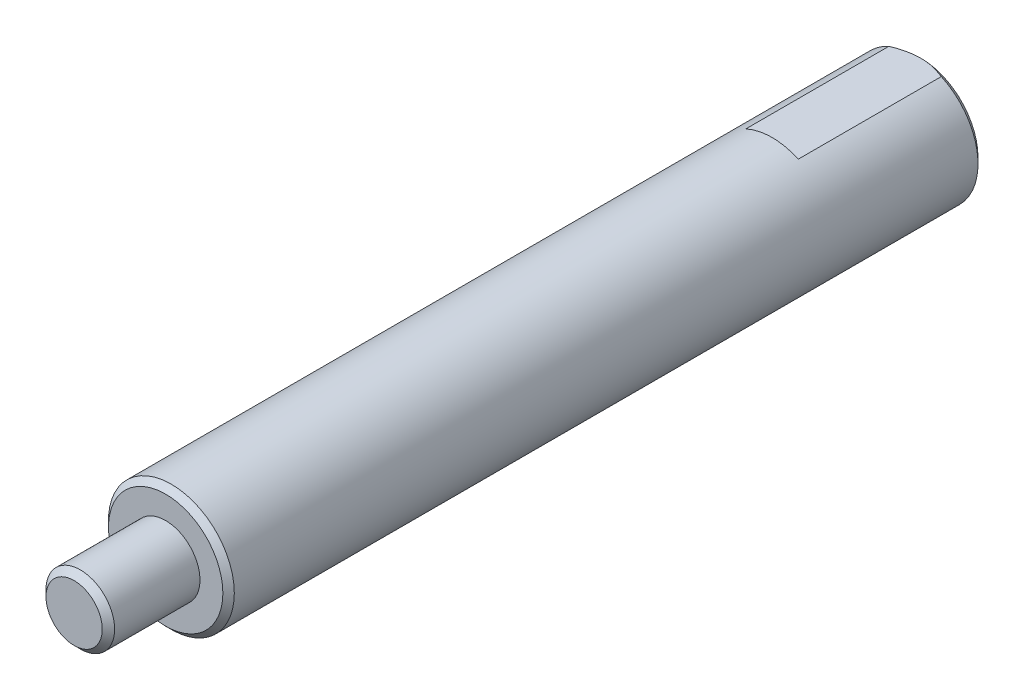
ISO-10303-21;
HEADER;
FILE_DESCRIPTION(('STEP AP214'),'2;1');
FILE_NAME('part.step','',(''),(''),'','','');
FILE_SCHEMA(('AUTOMOTIVE_DESIGN { 1 0 10303 214 1 1 1 1 }'));
ENDSEC;
DATA;
#1=APPLICATION_CONTEXT('core data for automotive mechanical design processes');
#2=APPLICATION_PROTOCOL_DEFINITION('international standard','automotive_design',2000,#1);
#3=PRODUCT_CONTEXT('',#1,'mechanical');
#4=PRODUCT('Part','Part','',(#3));
#5=PRODUCT_RELATED_PRODUCT_CATEGORY('part','',(#4));
#6=PRODUCT_DEFINITION_FORMATION('','',#4);
#7=PRODUCT_DEFINITION_CONTEXT('part definition',#1,'design');
#8=PRODUCT_DEFINITION('design','',#6,#7);
#9=PRODUCT_DEFINITION_SHAPE('','',#8);
#10=(LENGTH_UNIT() NAMED_UNIT(*) SI_UNIT(.MILLI.,.METRE.));
#11=(NAMED_UNIT(*) PLANE_ANGLE_UNIT() SI_UNIT($,.RADIAN.));
#12=(NAMED_UNIT(*) SI_UNIT($,.STERADIAN.) SOLID_ANGLE_UNIT());
#13=UNCERTAINTY_MEASURE_WITH_UNIT(LENGTH_MEASURE(1.E-05),#10,'distance_accuracy_value','');
#14=(GEOMETRIC_REPRESENTATION_CONTEXT(3) GLOBAL_UNCERTAINTY_ASSIGNED_CONTEXT((#13)) GLOBAL_UNIT_ASSIGNED_CONTEXT((#10,
#11,#12)) REPRESENTATION_CONTEXT('',''));
#15=CARTESIAN_POINT('',(0.,0.,0.));
#16=DIRECTION('',(0.,0.,1.));
#17=DIRECTION('',(1.,0.,0.));
#18=AXIS2_PLACEMENT_3D('',#15,#16,#17);
#19=CARTESIAN_POINT('',(0.,0.,0.5));
#20=DIRECTION('',(0.,0.,1.));
#21=DIRECTION('',(1.,0.,0.));
#22=AXIS2_PLACEMENT_3D('',#19,#20,#21);
#23=CONICAL_SURFACE('',#22,5.5,0.78539816339745);
#24=CARTESIAN_POINT('',(14.6848091307526,5.,10.5126921972504));
#25=CARTESIAN_POINT('',(14.4453208226167,5.,10.2859896541326));
#26=CARTESIAN_POINT('',(14.2055496886511,5.,10.0595855916861));
#27=CARTESIAN_POINT('',(13.7253433237666,5.,9.60748006149907));
#28=CARTESIAN_POINT('',(13.4849080888773,5.,9.38177859797622));
#29=CARTESIAN_POINT('',(12.7618962256915,5.,8.70536049882659));
#30=CARTESIAN_POINT('',(12.2781765081115,5.,8.25586410270803));
#31=CARTESIAN_POINT('',(11.2855202754839,5.,7.34194274282297));
#32=CARTESIAN_POINT('',(10.7764003173807,5.,6.87771631839149));
#33=CARTESIAN_POINT('',(10.0081237078525,5.,6.18705169530896));
#34=CARTESIAN_POINT('',(9.75140731219671,5.,5.9578999979517));
#35=CARTESIAN_POINT('',(9.23598125315536,5.,5.50185127115902));
#36=CARTESIAN_POINT('',(8.97727160895969,5.,5.27495422006519));
#37=CARTESIAN_POINT('',(8.45777334373332,5.,4.82431921159368));
#38=CARTESIAN_POINT('',(8.19698831207967,5.,4.60057712329846));
#39=CARTESIAN_POINT('',(7.67233583018279,5.,4.15670009726202));
#40=CARTESIAN_POINT('',(7.40846821574941,5.,3.93656535317609));
#41=CARTESIAN_POINT('',(6.87588577364978,5.,3.50025684420238));
#42=CARTESIAN_POINT('',(6.60715699098739,5.,3.28410005066112));
#43=CARTESIAN_POINT('',(6.06467897085509,5.,2.85824880719018));
#44=CARTESIAN_POINT('',(5.79093054202079,5.,2.64855333071798));
#45=CARTESIAN_POINT('',(5.24247824545985,5.,2.24225256251798));
#46=CARTESIAN_POINT('',(4.96790940819442,5.,2.04546689887263));
#47=CARTESIAN_POINT('',(4.54965992503179,5.,1.75937405975096));
#48=CARTESIAN_POINT('',(4.40911425501476,5.,1.66548481679903));
#49=CARTESIAN_POINT('',(4.12560555295647,5.,1.48143277641837));
#50=CARTESIAN_POINT('',(3.98264266122834,5.,1.39126976373144));
#51=CARTESIAN_POINT('',(3.69483138879456,5.,1.21601413329327));
#52=CARTESIAN_POINT('',(3.54999993591866,5.,1.13089382459601));
#53=CARTESIAN_POINT('',(3.25720950323682,5.,0.966134750499019));
#54=CARTESIAN_POINT('',(3.10925012756179,5.,0.886496684425031));
#55=CARTESIAN_POINT('',(2.81011276522684,5.,0.734125373534767));
#56=CARTESIAN_POINT('',(2.65894061859049,5.,0.661380726321655));
#57=CARTESIAN_POINT('',(2.35286256329063,5.,0.524242686166229));
#58=CARTESIAN_POINT('',(2.1979578875244,5.,0.459846579258843));
#59=CARTESIAN_POINT('',(1.96757107505039,5.,0.372774300731325));
#60=CARTESIAN_POINT('',(1.8935907421667,5.,0.346101437024888));
#61=CARTESIAN_POINT('',(1.74478391072055,5.,0.295222264195125));
#62=CARTESIAN_POINT('',(1.6699573739292,5.,0.271016067006738));
#63=CARTESIAN_POINT('',(1.44419485912741,5.,0.202417832217224));
#64=CARTESIAN_POINT('',(1.29200049197922,5.,0.162055560028231));
#65=CARTESIAN_POINT('',(0.985646477349409,5.,0.0940487123557023));
#66=CARTESIAN_POINT('',(0.831502220582748,5.,0.0663354854096099));
#67=CARTESIAN_POINT('',(0.521341182897074,5.,0.0247588689838312));
#68=CARTESIAN_POINT('',(0.365324622093103,5.,0.010893867288957));
#69=CARTESIAN_POINT('',(0.0516160098074453,5.,-0.0022057162804878));
#70=CARTESIAN_POINT('',(-0.106080254029352,5.,-0.00134130349866944));
#71=CARTESIAN_POINT('',(-0.420679844237957,5.,0.0152055027275052));
#72=CARTESIAN_POINT('',(-0.577583163483161,5.,0.0308880291126475));
#73=CARTESIAN_POINT('',(-0.890071145811222,5.,0.0762385891218348));
#74=CARTESIAN_POINT('',(-1.04564624986794,5.,0.105971488681455));
#75=CARTESIAN_POINT('',(-1.35387421816561,5.,0.177884717281035));
#76=CARTESIAN_POINT('',(-1.50652647420588,5.,0.220067607636096));
#77=CARTESIAN_POINT('',(-1.89899228144049,5.,0.343556358459174));
#78=CARTESIAN_POINT('',(-2.13618939052783,5.,0.433155135839384));
#79=CARTESIAN_POINT('',(-2.60192397109251,5.,0.632544932175527));
#80=CARTESIAN_POINT('',(-2.83045405488686,5.,0.742352730382475));
#81=CARTESIAN_POINT('',(-3.16847602424729,5.,0.918609391765239));
#82=CARTESIAN_POINT('',(-3.28087217249437,5.,0.979600606049455));
#83=CARTESIAN_POINT('',(-3.50386518493594,5.,1.10479681410002));
#84=CARTESIAN_POINT('',(-3.61446202600279,5.,1.16900184913248));
#85=CARTESIAN_POINT('',(-3.8339612658412,5.,1.30012039469569));
#86=CARTESIAN_POINT('',(-3.94286443721366,5.,1.36703261693913));
#87=CARTESIAN_POINT('',(-4.15918024646885,5.,1.50320934076163));
#88=CARTESIAN_POINT('',(-4.26659294268099,5.,1.57247374992057));
#89=CARTESIAN_POINT('',(-4.62241235734309,5.,1.80671898738886));
#90=CARTESIAN_POINT('',(-4.86786587008813,5.,1.97619150842306));
#91=CARTESIAN_POINT('',(-5.35312692377562,5.,2.32306349681887));
#92=CARTESIAN_POINT('',(-5.59293322072365,5.,2.50046468625872));
#93=CARTESIAN_POINT('',(-6.06824445724704,5.,2.86127560728366));
#94=CARTESIAN_POINT('',(-6.30374612411139,5.,3.04468963665743));
#95=CARTESIAN_POINT('',(-6.77116765089326,5.,3.4159716568427));
#96=CARTESIAN_POINT('',(-7.00308779793934,5.,3.60383928751786));
#97=CARTESIAN_POINT('',(-7.46479831203283,5.,3.9836485489202));
#98=CARTESIAN_POINT('',(-7.69457957218839,5.,4.17560122632346));
#99=CARTESIAN_POINT('',(-8.15180534086165,5.,4.56227258082258));
#100=CARTESIAN_POINT('',(-8.37924980937879,5.,4.75699130513139));
#101=CARTESIAN_POINT('',(-8.83212152767317,5.,5.1485683019278));
#102=CARTESIAN_POINT('',(-9.0575495779467,5.,5.34542564979235));
#103=CARTESIAN_POINT('',(-9.50680949169872,5.,5.74095449633201));
#104=CARTESIAN_POINT('',(-9.73064134364098,5.,5.93962600809504));
#105=CARTESIAN_POINT('',(-10.3554269609869,5.,6.49792304019962));
#106=CARTESIAN_POINT('',(-10.754889456792,5.,6.85921712232003));
#107=CARTESIAN_POINT('',(-11.550652043519,5.,7.58535654201275));
#108=CARTESIAN_POINT('',(-11.9469517546504,5.,7.95020229473565));
#109=CARTESIAN_POINT('',(-12.7346046209227,5.,8.68021687945508));
#110=CARTESIAN_POINT('',(-13.1259732089032,5.,9.04536907885111));
#111=CARTESIAN_POINT('',(-13.9067337252457,5.,9.77766414097997));
#112=CARTESIAN_POINT('',(-14.2961259422759,5.,10.1448066957958));
#113=CARTESIAN_POINT('',(-14.6848091307526,5.,10.5126921972504));
#114=B_SPLINE_CURVE_WITH_KNOTS('',3,(#24,#25,#26,#27,#28,#29,#30,#31,#32,#33,#34,#35,#36,#37,
#38,#39,#40,#41,#42,#43,#44,#45,#46,#47,#48,#49,#50,#51,#52,#53,#54,#55,#56,#57,#58,#59,#60,#61,
#62,#63,#64,#65,#66,#67,#68,#69,#70,#71,#72,#73,#74,#75,#76,#77,#78,#79,#80,#81,#82,#83,#84,#85,
#86,#87,#88,#89,#90,#91,#92,#93,#94,#95,#96,#97,#98,#99,#100,#101,#102,#103,#104,#105,#106,#107,
#108,#109,#110,#111,#112,#113),.UNSPECIFIED.,.F.,.F.,(4,2,2,2,2,2,2,2,2,2,2,2,2,2,2,2,2,2,2,2,2,
2,2,2,2,2,2,2,2,2,2,2,2,2,2,2,2,2,2,2,2,2,2,2,4),(0.,0.989311923310714,1.97862977419092,
3.95959337600444,6.02651317448656,7.05884240046668,8.09116170015311,9.12197286482421,
10.1528391870693,11.1873903696083,12.2217763312279,13.2349233326133,13.7419424161499,
14.2489321689684,14.7528143978997,15.256760784397,15.759858485699,16.2627922263955,
16.4986794127492,16.7345772986728,17.2064516788896,17.6757336299653,18.1449609407031,
18.6173431093418,19.0897295159999,19.5643184047903,20.039004998071,20.7982977886037,
21.5582238763945,21.941816072922,22.3254131961146,22.7088298733653,23.0922315031281,
23.9868071792121,24.8815781072258,25.7770031658049,26.6723560620082,27.5705534283762,
28.4687661443107,29.3666048627681,30.2644500636279,31.8802558929101,33.4962529155443,
35.1020309687598,36.7075673131427),.UNSPECIFIED.);
#115=CARTESIAN_POINT('',(2.29128784747799,5.,0.499999999999981));
#116=VERTEX_POINT('',#115);
#117=CARTESIAN_POINT('',(0.,5.,0.));
#118=VERTEX_POINT('',#117);
#119=EDGE_CURVE('E56',#116,#118,#114,.T.);
#120=ORIENTED_EDGE('',*,*,#119,.F.);
#121=CARTESIAN_POINT('',(0.,0.,0.5));
#122=DIRECTION('',(0.,0.,1.));
#123=DIRECTION('',(1.,0.,0.));
#124=AXIS2_PLACEMENT_3D('',#121,#122,#123);
#125=CIRCLE('',#124,5.5);
#126=CARTESIAN_POINT('',(2.29128784747792,-5.,0.5));
#127=VERTEX_POINT('',#126);
#128=EDGE_CURVE('E125',#127,#116,#125,.T.);
#129=ORIENTED_EDGE('',*,*,#128,.F.);
#130=CARTESIAN_POINT('',(-14.6848091307526,-5.,10.5126921972504));
#131=CARTESIAN_POINT('',(-14.4453208226167,-5.,10.2859896541326));
#132=CARTESIAN_POINT('',(-14.2055496886511,-5.,10.0595855916861));
#133=CARTESIAN_POINT('',(-13.7253433237666,-5.,9.60748006149907));
#134=CARTESIAN_POINT('',(-13.4849080888773,-5.,9.38177859797622));
#135=CARTESIAN_POINT('',(-12.7618962256915,-5.,8.70536049882659));
#136=CARTESIAN_POINT('',(-12.2781765081115,-5.,8.25586410270803));
#137=CARTESIAN_POINT('',(-11.2855202754839,-5.,7.34194274282297));
#138=CARTESIAN_POINT('',(-10.7764003173807,-5.,6.8777163183915));
#139=CARTESIAN_POINT('',(-10.0081237078525,-5.,6.18705169530897));
#140=CARTESIAN_POINT('',(-9.75140731219672,-5.,5.9578999979517));
#141=CARTESIAN_POINT('',(-9.23598125315536,-5.,5.50185127115902));
#142=CARTESIAN_POINT('',(-8.9772716089597,-5.,5.27495422006519));
#143=CARTESIAN_POINT('',(-8.45777334373332,-5.,4.82431921159368));
#144=CARTESIAN_POINT('',(-8.19698831207967,-5.,4.60057712329846));
#145=CARTESIAN_POINT('',(-7.6723358301828,-5.,4.15670009726202));
#146=CARTESIAN_POINT('',(-7.40846821574941,-5.,3.93656535317609));
#147=CARTESIAN_POINT('',(-6.87588577364978,-5.,3.50025684420238));
#148=CARTESIAN_POINT('',(-6.60715699098739,-5.,3.28410005066112));
#149=CARTESIAN_POINT('',(-6.0646789708551,-5.,2.85824880719018));
#150=CARTESIAN_POINT('',(-5.79093054202079,-5.,2.64855333071798));
#151=CARTESIAN_POINT('',(-5.24247824545985,-5.,2.24225256251799));
#152=CARTESIAN_POINT('',(-4.96790940819442,-5.,2.04546689887264));
#153=CARTESIAN_POINT('',(-4.54965992503179,-5.,1.75937405975097));
#154=CARTESIAN_POINT('',(-4.40911425501477,-5.,1.66548481679904));
#155=CARTESIAN_POINT('',(-4.12560555295648,-5.,1.48143277641838));
#156=CARTESIAN_POINT('',(-3.98264266122835,-5.,1.39126976373145));
#157=CARTESIAN_POINT('',(-3.69483138879457,-5.,1.21601413329327));
#158=CARTESIAN_POINT('',(-3.54999993591867,-5.,1.13089382459602));
#159=CARTESIAN_POINT('',(-3.25720950323683,-5.,0.966134750499024));
#160=CARTESIAN_POINT('',(-3.1092501275618,-5.,0.886496684425036));
#161=CARTESIAN_POINT('',(-2.81011276522685,-5.,0.734125373534773));
#162=CARTESIAN_POINT('',(-2.6589406185905,-5.,0.66138072632166));
#163=CARTESIAN_POINT('',(-2.35286256329064,-5.,0.524242686166234));
#164=CARTESIAN_POINT('',(-2.19795788752441,-5.,0.459846579258847));
#165=CARTESIAN_POINT('',(-1.9675710750504,-5.,0.372774300731329));
#166=CARTESIAN_POINT('',(-1.89359074216671,-5.,0.346101437024892));
#167=CARTESIAN_POINT('',(-1.74478391072056,-5.,0.295222264195128));
#168=CARTESIAN_POINT('',(-1.66995737392921,-5.,0.271016067006741));
#169=CARTESIAN_POINT('',(-1.44419485912741,-5.,0.202417832217227));
#170=CARTESIAN_POINT('',(-1.29200049197923,-5.,0.162055560028234));
#171=CARTESIAN_POINT('',(-0.985646477349418,-5.,0.0940487123557046));
#172=CARTESIAN_POINT('',(-0.831502220582757,-5.,0.066335485409612));
#173=CARTESIAN_POINT('',(-0.521341182897083,-5.,0.0247588689838325));
#174=CARTESIAN_POINT('',(-0.365324622093111,-5.,0.0108938672889575));
#175=CARTESIAN_POINT('',(-0.0516160098074518,-5.,-0.00220571628048841));
#176=CARTESIAN_POINT('',(0.106080254029347,-5.,-0.00134130349867044));
#177=CARTESIAN_POINT('',(0.420679844237952,-5.,0.0152055027275042));
#178=CARTESIAN_POINT('',(0.577583163483156,-5.,0.0308880291126468));
#179=CARTESIAN_POINT('',(0.890071145811216,-5.,0.0762385891218337));
#180=CARTESIAN_POINT('',(1.04564624986793,-5.,0.105971488681454));
#181=CARTESIAN_POINT('',(1.3538742181656,-5.,0.177884717281033));
#182=CARTESIAN_POINT('',(1.50652647420588,-5.,0.220067607636095));
#183=CARTESIAN_POINT('',(1.89899228144048,-5.,0.343556358459172));
#184=CARTESIAN_POINT('',(2.13618939052782,-5.,0.433155135839382));
#185=CARTESIAN_POINT('',(2.60192397109251,-5.,0.632544932175524));
#186=CARTESIAN_POINT('',(2.83045405488685,-5.,0.742352730382471));
#187=CARTESIAN_POINT('',(3.16847602424728,-5.,0.918609391765235));
#188=CARTESIAN_POINT('',(3.28087217249436,-5.,0.979600606049451));
#189=CARTESIAN_POINT('',(3.50386518493593,-5.,1.10479681410002));
#190=CARTESIAN_POINT('',(3.61446202600278,-5.,1.16900184913247));
#191=CARTESIAN_POINT('',(3.83396126584119,-5.,1.30012039469568));
#192=CARTESIAN_POINT('',(3.94286443721365,-5.,1.36703261693913));
#193=CARTESIAN_POINT('',(4.15918024646884,-5.,1.50320934076162));
#194=CARTESIAN_POINT('',(4.26659294268098,-5.,1.57247374992056));
#195=CARTESIAN_POINT('',(4.62241235734308,-5.,1.80671898738885));
#196=CARTESIAN_POINT('',(4.86786587008811,-5.,1.97619150842305));
#197=CARTESIAN_POINT('',(5.35312692377561,-5.,2.32306349681886));
#198=CARTESIAN_POINT('',(5.59293322072363,-5.,2.50046468625871));
#199=CARTESIAN_POINT('',(6.06824445724703,-5.,2.86127560728366));
#200=CARTESIAN_POINT('',(6.30374612411138,-5.,3.04468963665743));
#201=CARTESIAN_POINT('',(6.77116765089325,-5.,3.41597165684269));
#202=CARTESIAN_POINT('',(7.00308779793934,-5.,3.60383928751786));
#203=CARTESIAN_POINT('',(7.46479831203282,-5.,3.9836485489202));
#204=CARTESIAN_POINT('',(7.69457957218838,-5.,4.17560122632346));
#205=CARTESIAN_POINT('',(8.15180534086164,-5.,4.56227258082258));
#206=CARTESIAN_POINT('',(8.37924980937878,-5.,4.75699130513139));
#207=CARTESIAN_POINT('',(8.83212152767317,-5.,5.1485683019278));
#208=CARTESIAN_POINT('',(9.05754957794669,-5.,5.34542564979235));
#209=CARTESIAN_POINT('',(9.50680949169871,-5.,5.74095449633201));
#210=CARTESIAN_POINT('',(9.73064134364097,-5.,5.93962600809504));
#211=CARTESIAN_POINT('',(10.3554269609869,-5.,6.49792304019961));
#212=CARTESIAN_POINT('',(10.754889456792,-5.,6.85921712232003));
#213=CARTESIAN_POINT('',(11.550652043519,-5.,7.58535654201274));
#214=CARTESIAN_POINT('',(11.9469517546504,-5.,7.95020229473564));
#215=CARTESIAN_POINT('',(12.7346046209227,-5.,8.68021687945507));
#216=CARTESIAN_POINT('',(13.1259732089032,-5.,9.04536907885111));
#217=CARTESIAN_POINT('',(13.9067337252457,-5.,9.77766414097996));
#218=CARTESIAN_POINT('',(14.2961259422759,-5.,10.1448066957958));
#219=CARTESIAN_POINT('',(14.6848091307526,-5.,10.5126921972504));
#220=B_SPLINE_CURVE_WITH_KNOTS('',3,(#130,#131,#132,#133,#134,#135,#136,#137,#138,#139,#140,
#141,#142,#143,#144,#145,#146,#147,#148,#149,#150,#151,#152,#153,#154,#155,#156,#157,#158,#159,
#160,#161,#162,#163,#164,#165,#166,#167,#168,#169,#170,#171,#172,#173,#174,#175,#176,#177,#178,
#179,#180,#181,#182,#183,#184,#185,#186,#187,#188,#189,#190,#191,#192,#193,#194,#195,#196,#197,
#198,#199,#200,#201,#202,#203,#204,#205,#206,#207,#208,#209,#210,#211,#212,#213,#214,#215,#216,
#217,#218,#219),.UNSPECIFIED.,.F.,.F.,(4,2,2,2,2,2,2,2,2,2,2,2,2,2,2,2,2,2,2,2,2,2,2,2,2,2,2,2,
2,2,2,2,2,2,2,2,2,2,2,2,2,2,2,2,4),(0.,0.98931192331071,1.97862977419091,3.95959337600444,
6.02651317448655,7.05884240046668,8.0911617001531,9.1219728648242,10.1528391870693,
11.1873903696083,12.2217763312279,13.2349233326133,13.7419424161499,14.2489321689684,
14.7528143978997,15.2567607843969,15.759858485699,16.2627922263955,16.4986794127492,
16.7345772986728,17.2064516788896,17.6757336299653,18.1449609407031,18.6173431093418,
19.0897295159999,19.5643184047903,20.0390049980709,20.7982977886037,21.5582238763945,
21.941816072922,22.3254131961146,22.7088298733652,23.092231503128,23.9868071792121,
24.8815781072258,25.7770031658048,26.6723560620081,27.5705534283762,28.4687661443107,
29.3666048627681,30.2644500636279,31.8802558929101,33.4962529155443,35.1020309687598,
36.7075673131427),.UNSPECIFIED.);
#221=CARTESIAN_POINT('',(0.,-5.,0.));
#222=VERTEX_POINT('',#221);
#223=EDGE_CURVE('E141',#222,#127,#220,.T.);
#224=ORIENTED_EDGE('',*,*,#223,.F.);
#225=CARTESIAN_POINT('',(0.,0.,0.));
#226=DIRECTION('',(0.,0.,1.));
#227=DIRECTION('',(1.,0.,0.));
#228=AXIS2_PLACEMENT_3D('',#225,#226,#227);
#229=CIRCLE('',#228,5.);
#230=EDGE_CURVE('E132',#118,#222,#229,.F.);
#231=ORIENTED_EDGE('',*,*,#230,.F.);
#232=EDGE_LOOP('',(#120,#129,#224,#231));
#233=FACE_BOUND('',#232,.T.);
#234=ADVANCED_FACE('F41',(#233),#23,.T.);
#235=CARTESIAN_POINT('',(0.,0.,66.));
#236=DIRECTION('',(0.,0.,1.));
#237=DIRECTION('',(1.,0.,0.));
#238=AXIS2_PLACEMENT_3D('',#235,#236,#237);
#239=PLANE('',#238);
#240=CARTESIAN_POINT('',(0.,0.,66.));
#241=DIRECTION('',(0.,0.,1.));
#242=DIRECTION('',(1.,0.,0.));
#243=AXIS2_PLACEMENT_3D('',#240,#241,#242);
#244=CIRCLE('',#243,5.);
#245=CARTESIAN_POINT('',(5.,0.,66.));
#246=VERTEX_POINT('',#245);
#247=EDGE_CURVE('E131',#246,#246,#244,.T.);
#248=ORIENTED_EDGE('',*,*,#247,.T.);
#249=EDGE_LOOP('',(#248));
#250=FACE_BOUND('',#249,.T.);
#251=CARTESIAN_POINT('',(0.,0.,66.));
#252=DIRECTION('',(0.,0.,-1.));
#253=DIRECTION('',(-1.,0.,0.));
#254=AXIS2_PLACEMENT_3D('',#251,#252,#253);
#255=CIRCLE('',#254,3.);
#256=CARTESIAN_POINT('',(-3.,0.,66.));
#257=VERTEX_POINT('',#256);
#258=EDGE_CURVE('E100',#257,#257,#255,.T.);
#259=ORIENTED_EDGE('',*,*,#258,.T.);
#260=EDGE_LOOP('',(#259));
#261=FACE_BOUND('',#260,.T.);
#262=ADVANCED_FACE('F177',(#250,#261),#239,.T.);
#263=CARTESIAN_POINT('',(0.,0.,66.));
#264=DIRECTION('',(0.,0.,-1.));
#265=DIRECTION('',(-1.,0.,0.));
#266=AXIS2_PLACEMENT_3D('',#263,#264,#265);
#267=CYLINDRICAL_SURFACE('',#266,5.5);
#268=CARTESIAN_POINT('',(0.,0.,13.));
#269=DIRECTION('',(0.,0.,-1.));
#270=DIRECTION('',(-1.,0.,0.));
#271=AXIS2_PLACEMENT_3D('',#268,#269,#270);
#272=CIRCLE('',#271,5.5);
#273=CARTESIAN_POINT('',(-2.29128784747792,5.,13.));
#274=VERTEX_POINT('',#273);
#275=CARTESIAN_POINT('',(2.29128784747792,5.,13.));
#276=VERTEX_POINT('',#275);
#277=EDGE_CURVE('E11',#274,#276,#272,.T.);
#278=ORIENTED_EDGE('',*,*,#277,.F.);
#279=DIRECTION('',(0.,0.,-1.));
#280=VECTOR('',#279,1.);
#281=CARTESIAN_POINT('',(-2.29128784747792,5.,66.));
#282=LINE('',#281,#280);
#283=CARTESIAN_POINT('',(-2.29128784747792,5.,0.5));
#284=VERTEX_POINT('',#283);
#285=EDGE_CURVE('E117',#274,#284,#282,.T.);
#286=ORIENTED_EDGE('',*,*,#285,.T.);
#287=CARTESIAN_POINT('',(-2.29128784747799,-5.,0.499999999999981));
#288=VERTEX_POINT('',#287);
#289=EDGE_CURVE('E108',#284,#288,#125,.T.);
#290=ORIENTED_EDGE('',*,*,#289,.T.);
#291=DIRECTION('',(0.,0.,-1.));
#292=VECTOR('',#291,1.);
#293=CARTESIAN_POINT('',(-2.29128784747792,-5.,66.));
#294=LINE('',#293,#292);
#295=CARTESIAN_POINT('',(-2.29128784747792,-5.,13.));
#296=VERTEX_POINT('',#295);
#297=EDGE_CURVE('E97',#288,#296,#294,.F.);
#298=ORIENTED_EDGE('',*,*,#297,.T.);
#299=CARTESIAN_POINT('',(0.,0.,13.));
#300=DIRECTION('',(0.,0.,1.));
#301=DIRECTION('',(1.,0.,0.));
#302=AXIS2_PLACEMENT_3D('',#299,#300,#301);
#303=CIRCLE('',#302,5.5);
#304=CARTESIAN_POINT('',(2.29128784747792,-5.,13.));
#305=VERTEX_POINT('',#304);
#306=EDGE_CURVE('E49',#296,#305,#303,.T.);
#307=ORIENTED_EDGE('',*,*,#306,.T.);
#308=DIRECTION('',(0.,0.,-1.));
#309=VECTOR('',#308,1.);
#310=CARTESIAN_POINT('',(2.29128784747792,-5.,66.));
#311=LINE('',#310,#309);
#312=EDGE_CURVE('E98',#305,#127,#311,.T.);
#313=ORIENTED_EDGE('',*,*,#312,.T.);
#314=ORIENTED_EDGE('',*,*,#128,.T.);
#315=DIRECTION('',(0.,0.,-1.));
#316=VECTOR('',#315,1.);
#317=CARTESIAN_POINT('',(2.29128784747792,5.,66.));
#318=LINE('',#317,#316);
#319=EDGE_CURVE('E110',#116,#276,#318,.F.);
#320=ORIENTED_EDGE('',*,*,#319,.T.);
#321=EDGE_LOOP('',(#278,#286,#290,#298,#307,#313,#314,#320));
#322=FACE_BOUND('',#321,.T.);
#323=CARTESIAN_POINT('',(0.,0.,65.5));
#324=DIRECTION('',(0.,0.,1.));
#325=DIRECTION('',(1.,0.,0.));
#326=AXIS2_PLACEMENT_3D('',#323,#324,#325);
#327=CIRCLE('',#326,5.5);
#328=CARTESIAN_POINT('',(5.5,0.,65.5));
#329=VERTEX_POINT('',#328);
#330=EDGE_CURVE('E122',#329,#329,#327,.F.);
#331=ORIENTED_EDGE('',*,*,#330,.T.);
#332=EDGE_LOOP('',(#331));
#333=FACE_BOUND('',#332,.T.);
#334=ADVANCED_FACE('F104',(#322,#333),#267,.T.);
#335=CARTESIAN_POINT('',(0.,0.,0.));
#336=DIRECTION('',(0.,0.,1.));
#337=DIRECTION('',(1.,0.,0.));
#338=AXIS2_PLACEMENT_3D('',#335,#336,#337);
#339=PLANE('',#338);
#340=CARTESIAN_POINT('',(0.,0.,0.));
#341=DIRECTION('',(0.,0.,1.));
#342=DIRECTION('',(1.,0.,0.));
#343=AXIS2_PLACEMENT_3D('',#340,#341,#342);
#344=CIRCLE('',#343,2.6);
#345=CARTESIAN_POINT('',(2.6,0.,0.));
#346=VERTEX_POINT('',#345);
#347=EDGE_CURVE('E138',#346,#346,#344,.T.);
#348=ORIENTED_EDGE('',*,*,#347,.T.);
#349=EDGE_LOOP('',(#348));
#350=FACE_BOUND('',#349,.T.);
#351=EDGE_CURVE('E128',#222,#118,#229,.F.);
#352=ORIENTED_EDGE('',*,*,#351,.T.);
#353=ORIENTED_EDGE('',*,*,#230,.T.);
#354=EDGE_LOOP('',(#352,#353));
#355=FACE_BOUND('',#354,.T.);
#356=ADVANCED_FACE('F181',(#350,#355),#339,.F.);
#357=EDGE_CURVE('E149',#118,#284,#114,.T.);
#358=ORIENTED_EDGE('',*,*,#357,.F.);
#359=ORIENTED_EDGE('',*,*,#351,.F.);
#360=EDGE_CURVE('E64',#288,#222,#220,.T.);
#361=ORIENTED_EDGE('',*,*,#360,.F.);
#362=ORIENTED_EDGE('',*,*,#289,.F.);
#363=EDGE_LOOP('',(#358,#359,#361,#362));
#364=FACE_BOUND('',#363,.T.);
#365=ADVANCED_FACE('F155',(#364),#23,.T.);
#366=CARTESIAN_POINT('',(0.,0.,66.));
#367=DIRECTION('',(0.,0.,-1.));
#368=DIRECTION('',(-1.,0.,0.));
#369=AXIS2_PLACEMENT_3D('',#366,#367,#368);
#370=CONICAL_SURFACE('',#369,5.,0.785398163397436);
#371=ORIENTED_EDGE('',*,*,#330,.F.);
#372=EDGE_LOOP('',(#371));
#373=FACE_BOUND('',#372,.T.);
#374=ORIENTED_EDGE('',*,*,#247,.F.);
#375=EDGE_LOOP('',(#374));
#376=FACE_BOUND('',#375,.T.);
#377=ADVANCED_FACE('F170',(#373,#376),#370,.T.);
#378=CARTESIAN_POINT('',(0.,0.,12.4));
#379=DIRECTION('',(0.,0.,-1.));
#380=DIRECTION('',(-1.,0.,0.));
#381=AXIS2_PLACEMENT_3D('',#378,#379,#380);
#382=CONICAL_SURFACE('',#381,2.1,1.02974425867665);
#383=CARTESIAN_POINT('',(0.,0.,13.6618072999579));
#384=VERTEX_POINT('',#383);
#385=VERTEX_LOOP('',#384);
#386=FACE_BOUND('',#385,.T.);
#387=CARTESIAN_POINT('',(0.,0.,12.4));
#388=DIRECTION('',(0.,0.,-1.));
#389=DIRECTION('',(-1.,0.,0.));
#390=AXIS2_PLACEMENT_3D('',#387,#388,#389);
#391=CIRCLE('',#390,2.1);
#392=CARTESIAN_POINT('',(-2.1,0.,12.4));
#393=VERTEX_POINT('',#392);
#394=EDGE_CURVE('E119',#393,#393,#391,.T.);
#395=ORIENTED_EDGE('',*,*,#394,.T.);
#396=EDGE_LOOP('',(#395));
#397=FACE_BOUND('',#396,.T.);
#398=ADVANCED_FACE('F166',(#386,#397),#382,.F.);
#399=CARTESIAN_POINT('',(0.,0.,0.));
#400=DIRECTION('',(0.,0.,-1.));
#401=DIRECTION('',(-1.,0.,0.));
#402=AXIS2_PLACEMENT_3D('',#399,#400,#401);
#403=CYLINDRICAL_SURFACE('',#402,2.1);
#404=CARTESIAN_POINT('',(0.,0.,0.500000000000007));
#405=DIRECTION('',(0.,0.,1.));
#406=DIRECTION('',(1.,0.,0.));
#407=AXIS2_PLACEMENT_3D('',#404,#405,#406);
#408=CIRCLE('',#407,2.1);
#409=CARTESIAN_POINT('',(2.1,0.,0.500000000000007));
#410=VERTEX_POINT('',#409);
#411=EDGE_CURVE('E135',#410,#410,#408,.F.);
#412=ORIENTED_EDGE('',*,*,#411,.T.);
#413=EDGE_LOOP('',(#412));
#414=FACE_BOUND('',#413,.T.);
#415=ORIENTED_EDGE('',*,*,#394,.F.);
#416=EDGE_LOOP('',(#415));
#417=FACE_BOUND('',#416,.T.);
#418=ADVANCED_FACE('F163',(#414,#417),#403,.F.);
#419=CARTESIAN_POINT('',(0.,0.,0.500000000000007));
#420=DIRECTION('',(0.,0.,-1.));
#421=DIRECTION('',(-1.,0.,0.));
#422=AXIS2_PLACEMENT_3D('',#419,#420,#421);
#423=CONICAL_SURFACE('',#422,2.1,0.785398163397448);
#424=ORIENTED_EDGE('',*,*,#347,.F.);
#425=EDGE_LOOP('',(#424));
#426=FACE_BOUND('',#425,.T.);
#427=ORIENTED_EDGE('',*,*,#411,.F.);
#428=EDGE_LOOP('',(#427));
#429=FACE_BOUND('',#428,.T.);
#430=ADVANCED_FACE('F43',(#426,#429),#423,.F.);
#431=CARTESIAN_POINT('',(0.,0.,13.));
#432=DIRECTION('',(0.,0.,1.));
#433=DIRECTION('',(1.,0.,0.));
#434=AXIS2_PLACEMENT_3D('',#431,#432,#433);
#435=PLANE('',#434);
#436=DIRECTION('',(1.,0.,0.));
#437=VECTOR('',#436,1.);
#438=CARTESIAN_POINT('',(5.,-5.,13.));
#439=LINE('',#438,#437);
#440=EDGE_CURVE('E92',#296,#305,#439,.T.);
#441=ORIENTED_EDGE('',*,*,#440,.T.);
#442=ORIENTED_EDGE('',*,*,#306,.F.);
#443=EDGE_LOOP('',(#441,#442));
#444=FACE_BOUND('',#443,.T.);
#445=ADVANCED_FACE('F91',(#444),#435,.F.);
#446=CARTESIAN_POINT('',(5.,-5.,13.));
#447=DIRECTION('',(0.,1.,0.));
#448=DIRECTION('',(0.,0.,1.));
#449=AXIS2_PLACEMENT_3D('',#446,#447,#448);
#450=PLANE('',#449);
#451=ORIENTED_EDGE('',*,*,#440,.F.);
#452=ORIENTED_EDGE('',*,*,#297,.F.);
#453=ORIENTED_EDGE('',*,*,#360,.T.);
#454=ORIENTED_EDGE('',*,*,#223,.T.);
#455=ORIENTED_EDGE('',*,*,#312,.F.);
#456=EDGE_LOOP('',(#451,#452,#453,#454,#455));
#457=FACE_BOUND('',#456,.T.);
#458=ADVANCED_FACE('F96',(#457),#450,.F.);
#459=CARTESIAN_POINT('',(0.,0.,13.));
#460=DIRECTION('',(0.,0.,-1.));
#461=DIRECTION('',(-1.,0.,0.));
#462=AXIS2_PLACEMENT_3D('',#459,#460,#461);
#463=PLANE('',#462);
#464=ORIENTED_EDGE('',*,*,#277,.T.);
#465=DIRECTION('',(-1.,0.,0.));
#466=VECTOR('',#465,1.);
#467=CARTESIAN_POINT('',(5.,5.,13.));
#468=LINE('',#467,#466);
#469=EDGE_CURVE('E99',#276,#274,#468,.T.);
#470=ORIENTED_EDGE('',*,*,#469,.T.);
#471=EDGE_LOOP('',(#464,#470));
#472=FACE_BOUND('',#471,.T.);
#473=ADVANCED_FACE('F162',(#472),#463,.T.);
#474=CARTESIAN_POINT('',(5.,5.,13.));
#475=DIRECTION('',(0.,-1.,0.));
#476=DIRECTION('',(0.,0.,-1.));
#477=AXIS2_PLACEMENT_3D('',#474,#475,#476);
#478=PLANE('',#477);
#479=ORIENTED_EDGE('',*,*,#469,.F.);
#480=ORIENTED_EDGE('',*,*,#319,.F.);
#481=ORIENTED_EDGE('',*,*,#119,.T.);
#482=ORIENTED_EDGE('',*,*,#357,.T.);
#483=ORIENTED_EDGE('',*,*,#285,.F.);
#484=EDGE_LOOP('',(#479,#480,#481,#482,#483));
#485=FACE_BOUND('',#484,.T.);
#486=ADVANCED_FACE('F203',(#485),#478,.F.);
#487=CARTESIAN_POINT('',(0.,0.,74.));
#488=DIRECTION('',(0.,0.,-1.));
#489=DIRECTION('',(-1.,0.,0.));
#490=AXIS2_PLACEMENT_3D('',#487,#488,#489);
#491=CYLINDRICAL_SURFACE('',#490,3.);
#492=ORIENTED_EDGE('',*,*,#258,.F.);
#493=EDGE_LOOP('',(#492));
#494=FACE_BOUND('',#493,.T.);
#495=CARTESIAN_POINT('',(0.,0.,73.4585));
#496=DIRECTION('',(0.,0.,-1.));
#497=DIRECTION('',(-1.,0.,0.));
#498=AXIS2_PLACEMENT_3D('',#495,#496,#497);
#499=CIRCLE('',#498,3.);
#500=CARTESIAN_POINT('',(-3.,0.,73.4585));
#501=VERTEX_POINT('',#500);
#502=EDGE_CURVE('E223',#501,#501,#499,.T.);
#503=ORIENTED_EDGE('',*,*,#502,.T.);
#504=EDGE_LOOP('',(#503));
#505=FACE_BOUND('',#504,.T.);
#506=ADVANCED_FACE('F210',(#494,#505),#491,.T.);
#507=CARTESIAN_POINT('',(0.,0.,74.));
#508=DIRECTION('',(0.,0.,-1.));
#509=DIRECTION('',(-1.,0.,0.));
#510=AXIS2_PLACEMENT_3D('',#507,#508,#509);
#511=CONICAL_SURFACE('',#510,2.4585,0.785398163397448);
#512=ORIENTED_EDGE('',*,*,#502,.F.);
#513=EDGE_LOOP('',(#512));
#514=FACE_BOUND('',#513,.T.);
#515=CARTESIAN_POINT('',(0.,0.,74.));
#516=DIRECTION('',(0.,0.,-1.));
#517=DIRECTION('',(-1.,0.,0.));
#518=AXIS2_PLACEMENT_3D('',#515,#516,#517);
#519=CIRCLE('',#518,2.4585);
#520=CARTESIAN_POINT('',(-2.4585,0.,74.));
#521=VERTEX_POINT('',#520);
#522=EDGE_CURVE('E226',#521,#521,#519,.T.);
#523=ORIENTED_EDGE('',*,*,#522,.T.);
#524=EDGE_LOOP('',(#523));
#525=FACE_BOUND('',#524,.T.);
#526=ADVANCED_FACE('F175',(#514,#525),#511,.T.);
#527=CARTESIAN_POINT('',(0.,0.,74.));
#528=DIRECTION('',(0.,0.,1.));
#529=DIRECTION('',(1.,0.,0.));
#530=AXIS2_PLACEMENT_3D('',#527,#528,#529);
#531=PLANE('',#530);
#532=ORIENTED_EDGE('',*,*,#522,.F.);
#533=EDGE_LOOP('',(#532));
#534=FACE_BOUND('',#533,.T.);
#535=ADVANCED_FACE('F172',(#534),#531,.T.);
#536=CLOSED_SHELL('',(#234,#262,#334,#356,#365,#377,#398,#418,#430,#445,#458,#473,#486,#506,
#526,#535));
#537=MANIFOLD_SOLID_BREP('B2',#536);
#538=ADVANCED_BREP_SHAPE_REPRESENTATION('',(#18,#537),#14);
#539=SHAPE_DEFINITION_REPRESENTATION(#9,#538);
ENDSEC;
END-ISO-10303-21;
